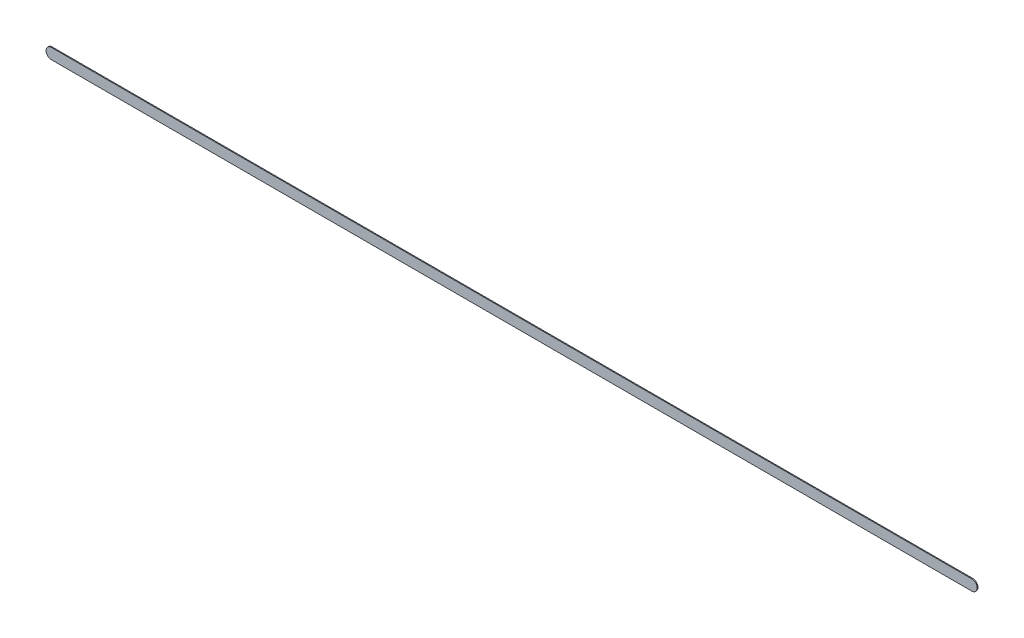
ISO-10303-21;
HEADER;
FILE_DESCRIPTION(('STEP AP214'),'2;1');
FILE_NAME('part.step','',(''),(''),'','','');
FILE_SCHEMA(('AUTOMOTIVE_DESIGN { 1 0 10303 214 1 1 1 1 }'));
ENDSEC;
DATA;
#1=APPLICATION_CONTEXT('core data for automotive mechanical design processes');
#2=APPLICATION_PROTOCOL_DEFINITION('international standard','automotive_design',2000,#1);
#3=PRODUCT_CONTEXT('',#1,'mechanical');
#4=PRODUCT('Part','Part','',(#3));
#5=PRODUCT_RELATED_PRODUCT_CATEGORY('part','',(#4));
#6=PRODUCT_DEFINITION_FORMATION('','',#4);
#7=PRODUCT_DEFINITION_CONTEXT('part definition',#1,'design');
#8=PRODUCT_DEFINITION('design','',#6,#7);
#9=PRODUCT_DEFINITION_SHAPE('','',#8);
#10=(LENGTH_UNIT() NAMED_UNIT(*) SI_UNIT(.MILLI.,.METRE.));
#11=(NAMED_UNIT(*) PLANE_ANGLE_UNIT() SI_UNIT($,.RADIAN.));
#12=(NAMED_UNIT(*) SI_UNIT($,.STERADIAN.) SOLID_ANGLE_UNIT());
#13=UNCERTAINTY_MEASURE_WITH_UNIT(LENGTH_MEASURE(1.E-05),#10,'distance_accuracy_value','');
#14=(GEOMETRIC_REPRESENTATION_CONTEXT(3) GLOBAL_UNCERTAINTY_ASSIGNED_CONTEXT((#13)) GLOBAL_UNIT_ASSIGNED_CONTEXT((#10,
#11,#12)) REPRESENTATION_CONTEXT('',''));
#15=CARTESIAN_POINT('',(0.,0.,0.));
#16=DIRECTION('',(0.,0.,1.));
#17=DIRECTION('',(1.,0.,0.));
#18=AXIS2_PLACEMENT_3D('',#15,#16,#17);
#19=CARTESIAN_POINT('',(27.875,42.6625,1.1723000001));
#20=DIRECTION('',(0.,0.,1.));
#21=DIRECTION('',(1.,0.,0.));
#22=AXIS2_PLACEMENT_3D('',#19,#20,#21);
#23=PLANE('',#22);
#24=CARTESIAN_POINT('',(34.375,42.6625,1.1723000001));
#25=DIRECTION('',(0.,0.,-1.));
#26=DIRECTION('',(1.,0.,0.));
#27=AXIS2_PLACEMENT_3D('',#24,#25,#26);
#28=CIRCLE('',#27,0.075);
#29=CARTESIAN_POINT('',(34.375,42.7375,1.1723000001));
#30=VERTEX_POINT('',#29);
#31=CARTESIAN_POINT('',(34.45,42.6625,1.1723000001));
#32=VERTEX_POINT('',#31);
#33=EDGE_CURVE('E27',#30,#32,#28,.T.);
#34=ORIENTED_EDGE('',*,*,#33,.F.);
#35=DIRECTION('',(-1.,0.,0.));
#36=VECTOR('',#35,1.);
#37=CARTESIAN_POINT('',(21.375,42.7375,1.1723000001));
#38=LINE('',#37,#36);
#39=CARTESIAN_POINT('',(21.375,42.7375,1.1723000001));
#40=VERTEX_POINT('',#39);
#41=EDGE_CURVE('E134',#30,#40,#38,.T.);
#42=ORIENTED_EDGE('',*,*,#41,.T.);
#43=CARTESIAN_POINT('',(21.375,42.6625,1.1723000001));
#44=DIRECTION('',(0.,0.,1.));
#45=DIRECTION('',(1.,0.,0.));
#46=AXIS2_PLACEMENT_3D('',#43,#44,#45);
#47=CIRCLE('',#46,0.075);
#48=CARTESIAN_POINT('',(21.375,42.5875,1.1723000001));
#49=VERTEX_POINT('',#48);
#50=EDGE_CURVE('E101',#40,#49,#47,.T.);
#51=ORIENTED_EDGE('',*,*,#50,.T.);
#52=DIRECTION('',(1.,0.,0.));
#53=VECTOR('',#52,1.);
#54=CARTESIAN_POINT('',(34.375,42.5875,1.1723000001));
#55=LINE('',#54,#53);
#56=CARTESIAN_POINT('',(34.375,42.5875,1.1723000001));
#57=VERTEX_POINT('',#56);
#58=EDGE_CURVE('E11',#49,#57,#55,.T.);
#59=ORIENTED_EDGE('',*,*,#58,.T.);
#60=CARTESIAN_POINT('',(34.375,42.6625,1.1723000001));
#61=DIRECTION('',(0.,0.,-1.));
#62=DIRECTION('',(1.,0.,0.));
#63=AXIS2_PLACEMENT_3D('',#60,#61,#62);
#64=CIRCLE('',#63,0.075);
#65=EDGE_CURVE('E99',#32,#57,#64,.T.);
#66=ORIENTED_EDGE('',*,*,#65,.F.);
#67=EDGE_LOOP('',(#34,#42,#51,#59,#66));
#68=FACE_BOUND('',#67,.T.);
#69=ADVANCED_FACE('F17',(#68),#23,.T.);
#70=CARTESIAN_POINT('',(34.375,42.5875,1.1596000001));
#71=DIRECTION('',(0.,1.,0.));
#72=DIRECTION('',(1.,0.,0.));
#73=AXIS2_PLACEMENT_3D('',#70,#71,#72);
#74=PLANE('',#73);
#75=DIRECTION('',(0.,0.,1.));
#76=VECTOR('',#75,1.);
#77=CARTESIAN_POINT('',(21.375,42.5875,1.1596000001));
#78=LINE('',#77,#76);
#79=CARTESIAN_POINT('',(21.375,42.5875,1.1596000001));
#80=VERTEX_POINT('',#79);
#81=EDGE_CURVE('E131',#80,#49,#78,.T.);
#82=ORIENTED_EDGE('',*,*,#81,.F.);
#83=DIRECTION('',(1.,0.,0.));
#84=VECTOR('',#83,1.);
#85=CARTESIAN_POINT('',(27.875,42.5875,1.1596000001));
#86=LINE('',#85,#84);
#87=CARTESIAN_POINT('',(34.375,42.5875,1.1596000001));
#88=VERTEX_POINT('',#87);
#89=EDGE_CURVE('E78',#80,#88,#86,.T.);
#90=ORIENTED_EDGE('',*,*,#89,.T.);
#91=DIRECTION('',(0.,0.,-1.));
#92=VECTOR('',#91,1.);
#93=CARTESIAN_POINT('',(34.375,42.5875,1.1596000001));
#94=LINE('',#93,#92);
#95=EDGE_CURVE('E20',#57,#88,#94,.T.);
#96=ORIENTED_EDGE('',*,*,#95,.F.);
#97=ORIENTED_EDGE('',*,*,#58,.F.);
#98=EDGE_LOOP('',(#82,#90,#96,#97));
#99=FACE_BOUND('',#98,.T.);
#100=ADVANCED_FACE('F103',(#99),#74,.F.);
#101=CARTESIAN_POINT('',(34.375,42.6625,1.1596000001));
#102=DIRECTION('',(0.,0.,1.));
#103=DIRECTION('',(1.,0.,0.));
#104=AXIS2_PLACEMENT_3D('',#101,#102,#103);
#105=CYLINDRICAL_SURFACE('',#104,0.075);
#106=DIRECTION('',(0.,0.,1.));
#107=VECTOR('',#106,1.);
#108=CARTESIAN_POINT('',(34.45,42.6625,1.1596000001));
#109=LINE('',#108,#107);
#110=CARTESIAN_POINT('',(34.45,42.6625,1.1596000001));
#111=VERTEX_POINT('',#110);
#112=EDGE_CURVE('E109',#111,#32,#109,.T.);
#113=ORIENTED_EDGE('',*,*,#112,.F.);
#114=CARTESIAN_POINT('',(34.375,42.6625,1.1596000001));
#115=DIRECTION('',(0.,0.,1.));
#116=DIRECTION('',(1.,0.,0.));
#117=AXIS2_PLACEMENT_3D('',#114,#115,#116);
#118=CIRCLE('',#117,0.075);
#119=CARTESIAN_POINT('',(34.375,42.7375,1.1596000001));
#120=VERTEX_POINT('',#119);
#121=EDGE_CURVE('E66',#111,#120,#118,.T.);
#122=ORIENTED_EDGE('',*,*,#121,.T.);
#123=DIRECTION('',(0.,0.,1.));
#124=VECTOR('',#123,1.);
#125=CARTESIAN_POINT('',(34.375,42.7375,1.1596000001));
#126=LINE('',#125,#124);
#127=EDGE_CURVE('E94',#120,#30,#126,.T.);
#128=ORIENTED_EDGE('',*,*,#127,.T.);
#129=ORIENTED_EDGE('',*,*,#33,.T.);
#130=EDGE_LOOP('',(#113,#122,#128,#129));
#131=FACE_BOUND('',#130,.T.);
#132=ADVANCED_FACE('F161',(#131),#105,.T.);
#133=CARTESIAN_POINT('',(21.375,42.7375,1.1596000001));
#134=DIRECTION('',(0.,-1.,0.));
#135=DIRECTION('',(0.,0.,-1.));
#136=AXIS2_PLACEMENT_3D('',#133,#134,#135);
#137=PLANE('',#136);
#138=ORIENTED_EDGE('',*,*,#127,.F.);
#139=DIRECTION('',(-1.,0.,0.));
#140=VECTOR('',#139,1.);
#141=CARTESIAN_POINT('',(27.875,42.7375,1.1596000001));
#142=LINE('',#141,#140);
#143=CARTESIAN_POINT('',(21.375,42.7375,1.1596000001));
#144=VERTEX_POINT('',#143);
#145=EDGE_CURVE('E107',#120,#144,#142,.T.);
#146=ORIENTED_EDGE('',*,*,#145,.T.);
#147=DIRECTION('',(0.,0.,-1.));
#148=VECTOR('',#147,1.);
#149=CARTESIAN_POINT('',(21.375,42.7375,1.1596000001));
#150=LINE('',#149,#148);
#151=EDGE_CURVE('E87',#40,#144,#150,.T.);
#152=ORIENTED_EDGE('',*,*,#151,.F.);
#153=ORIENTED_EDGE('',*,*,#41,.F.);
#154=EDGE_LOOP('',(#138,#146,#152,#153));
#155=FACE_BOUND('',#154,.T.);
#156=ADVANCED_FACE('F154',(#155),#137,.F.);
#157=CARTESIAN_POINT('',(21.375,42.6625,1.1596000001));
#158=DIRECTION('',(0.,0.,1.));
#159=DIRECTION('',(1.,0.,0.));
#160=AXIS2_PLACEMENT_3D('',#157,#158,#159);
#161=CYLINDRICAL_SURFACE('',#160,0.075);
#162=CARTESIAN_POINT('',(21.375,42.6625,1.1596000001));
#163=DIRECTION('',(0.,0.,1.));
#164=DIRECTION('',(1.,0.,0.));
#165=AXIS2_PLACEMENT_3D('',#162,#163,#164);
#166=CIRCLE('',#165,0.075);
#167=EDGE_CURVE('E126',#144,#80,#166,.T.);
#168=ORIENTED_EDGE('',*,*,#167,.T.);
#169=ORIENTED_EDGE('',*,*,#81,.T.);
#170=ORIENTED_EDGE('',*,*,#50,.F.);
#171=ORIENTED_EDGE('',*,*,#151,.T.);
#172=EDGE_LOOP('',(#168,#169,#170,#171));
#173=FACE_BOUND('',#172,.T.);
#174=ADVANCED_FACE('F143',(#173),#161,.T.);
#175=CARTESIAN_POINT('',(27.875,42.6625,1.1596000001));
#176=DIRECTION('',(0.,0.,1.));
#177=DIRECTION('',(1.,0.,0.));
#178=AXIS2_PLACEMENT_3D('',#175,#176,#177);
#179=PLANE('',#178);
#180=ORIENTED_EDGE('',*,*,#145,.F.);
#181=ORIENTED_EDGE('',*,*,#121,.F.);
#182=CARTESIAN_POINT('',(34.375,42.6625,1.1596000001));
#183=DIRECTION('',(0.,0.,1.));
#184=DIRECTION('',(1.,0.,0.));
#185=AXIS2_PLACEMENT_3D('',#182,#183,#184);
#186=CIRCLE('',#185,0.075);
#187=EDGE_CURVE('E116',#88,#111,#186,.T.);
#188=ORIENTED_EDGE('',*,*,#187,.F.);
#189=ORIENTED_EDGE('',*,*,#89,.F.);
#190=ORIENTED_EDGE('',*,*,#167,.F.);
#191=EDGE_LOOP('',(#180,#181,#188,#189,#190));
#192=FACE_BOUND('',#191,.T.);
#193=ADVANCED_FACE('F144',(#192),#179,.F.);
#194=CARTESIAN_POINT('',(34.375,42.6625,1.1596000001));
#195=DIRECTION('',(0.,0.,1.));
#196=DIRECTION('',(1.,0.,0.));
#197=AXIS2_PLACEMENT_3D('',#194,#195,#196);
#198=CYLINDRICAL_SURFACE('',#197,0.075);
#199=ORIENTED_EDGE('',*,*,#187,.T.);
#200=ORIENTED_EDGE('',*,*,#112,.T.);
#201=ORIENTED_EDGE('',*,*,#65,.T.);
#202=ORIENTED_EDGE('',*,*,#95,.T.);
#203=EDGE_LOOP('',(#199,#200,#201,#202));
#204=FACE_BOUND('',#203,.T.);
#205=ADVANCED_FACE('F108',(#204),#198,.T.);
#206=CLOSED_SHELL('',(#69,#100,#132,#156,#174,#193,#205));
#207=MANIFOLD_SOLID_BREP('B1',#206);
#208=ADVANCED_BREP_SHAPE_REPRESENTATION('',(#18,#207),#14);
#209=SHAPE_DEFINITION_REPRESENTATION(#9,#208);
ENDSEC;
END-ISO-10303-21;
